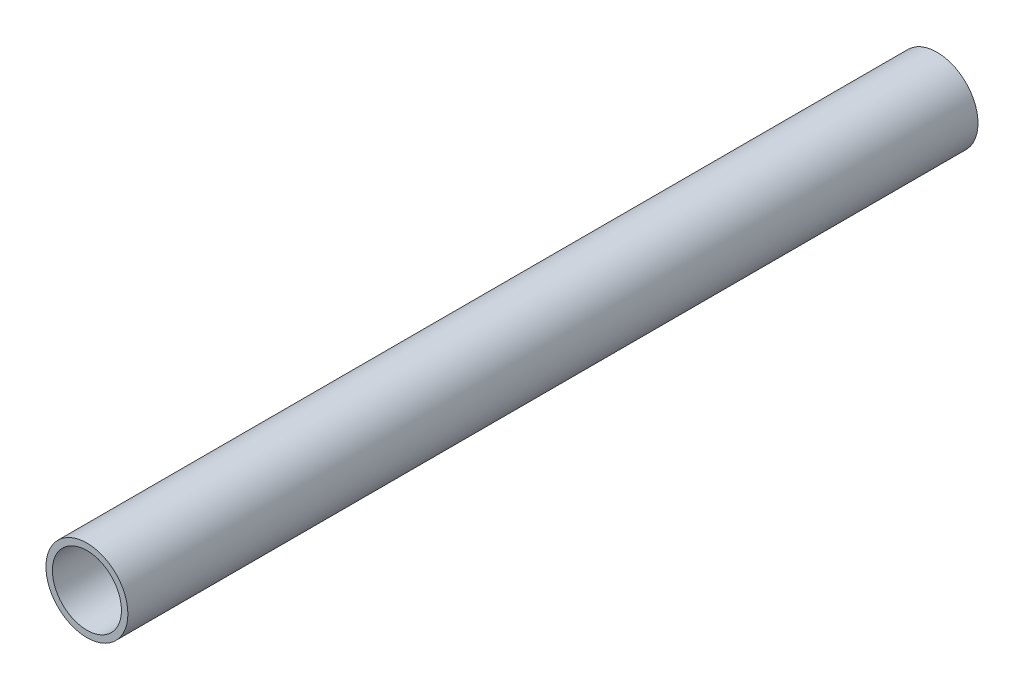
ISO-10303-21;
HEADER;
FILE_DESCRIPTION(('STEP AP214'),'2;1');
FILE_NAME('part.step','',(''),(''),'','','');
FILE_SCHEMA(('AUTOMOTIVE_DESIGN { 1 0 10303 214 1 1 1 1 }'));
ENDSEC;
DATA;
#1=APPLICATION_CONTEXT('core data for automotive mechanical design processes');
#2=APPLICATION_PROTOCOL_DEFINITION('international standard','automotive_design',2000,#1);
#3=PRODUCT_CONTEXT('',#1,'mechanical');
#4=PRODUCT('Part','Part','',(#3));
#5=PRODUCT_RELATED_PRODUCT_CATEGORY('part','',(#4));
#6=PRODUCT_DEFINITION_FORMATION('','',#4);
#7=PRODUCT_DEFINITION_CONTEXT('part definition',#1,'design');
#8=PRODUCT_DEFINITION('design','',#6,#7);
#9=PRODUCT_DEFINITION_SHAPE('','',#8);
#10=(LENGTH_UNIT() NAMED_UNIT(*) SI_UNIT(.MILLI.,.METRE.));
#11=(NAMED_UNIT(*) PLANE_ANGLE_UNIT() SI_UNIT($,.RADIAN.));
#12=(NAMED_UNIT(*) SI_UNIT($,.STERADIAN.) SOLID_ANGLE_UNIT());
#13=UNCERTAINTY_MEASURE_WITH_UNIT(LENGTH_MEASURE(1.E-05),#10,'distance_accuracy_value','');
#14=(GEOMETRIC_REPRESENTATION_CONTEXT(3) GLOBAL_UNCERTAINTY_ASSIGNED_CONTEXT((#13)) GLOBAL_UNIT_ASSIGNED_CONTEXT((#10,
#11,#12)) REPRESENTATION_CONTEXT('',''));
#15=CARTESIAN_POINT('',(0.,0.,0.));
#16=DIRECTION('',(0.,0.,1.));
#17=DIRECTION('',(1.,0.,0.));
#18=AXIS2_PLACEMENT_3D('',#15,#16,#17);
#19=CARTESIAN_POINT('',(0.,0.,461.5));
#20=DIRECTION('',(0.,0.,1.));
#21=DIRECTION('',(1.,0.,0.));
#22=AXIS2_PLACEMENT_3D('',#19,#20,#21);
#23=PLANE('',#22);
#24=CARTESIAN_POINT('',(0.,0.,461.5));
#25=DIRECTION('',(0.,0.,1.));
#26=DIRECTION('',(1.,0.,0.));
#27=AXIS2_PLACEMENT_3D('',#24,#25,#26);
#28=CIRCLE('',#27,44.5);
#29=CARTESIAN_POINT('',(44.5,0.,461.5));
#30=VERTEX_POINT('',#29);
#31=EDGE_CURVE('E10',#30,#30,#28,.T.);
#32=ORIENTED_EDGE('',*,*,#31,.T.);
#33=EDGE_LOOP('',(#32));
#34=FACE_BOUND('',#33,.T.);
#35=CARTESIAN_POINT('',(0.,0.,461.5));
#36=DIRECTION('',(0.,0.,1.));
#37=DIRECTION('',(1.,0.,0.));
#38=AXIS2_PLACEMENT_3D('',#35,#36,#37);
#39=CIRCLE('',#38,37.5);
#40=CARTESIAN_POINT('',(37.5,0.,461.5));
#41=VERTEX_POINT('',#40);
#42=EDGE_CURVE('E42',#41,#41,#39,.T.);
#43=ORIENTED_EDGE('',*,*,#42,.F.);
#44=EDGE_LOOP('',(#43));
#45=FACE_BOUND('',#44,.T.);
#46=ADVANCED_FACE('F31',(#34,#45),#23,.T.);
#47=CARTESIAN_POINT('',(0.,0.,-461.5));
#48=DIRECTION('',(0.,0.,1.));
#49=DIRECTION('',(1.,0.,0.));
#50=AXIS2_PLACEMENT_3D('',#47,#48,#49);
#51=PLANE('',#50);
#52=CARTESIAN_POINT('',(0.,0.,-461.5));
#53=DIRECTION('',(0.,0.,1.));
#54=DIRECTION('',(1.,0.,0.));
#55=AXIS2_PLACEMENT_3D('',#52,#53,#54);
#56=CIRCLE('',#55,44.5);
#57=CARTESIAN_POINT('',(44.5,0.,-461.5));
#58=VERTEX_POINT('',#57);
#59=EDGE_CURVE('E35',#58,#58,#56,.T.);
#60=ORIENTED_EDGE('',*,*,#59,.F.);
#61=EDGE_LOOP('',(#60));
#62=FACE_BOUND('',#61,.T.);
#63=CARTESIAN_POINT('',(0.,0.,-461.5));
#64=DIRECTION('',(0.,0.,1.));
#65=DIRECTION('',(1.,0.,0.));
#66=AXIS2_PLACEMENT_3D('',#63,#64,#65);
#67=CIRCLE('',#66,37.5);
#68=CARTESIAN_POINT('',(37.5,0.,-461.5));
#69=VERTEX_POINT('',#68);
#70=EDGE_CURVE('E44',#69,#69,#67,.T.);
#71=ORIENTED_EDGE('',*,*,#70,.T.);
#72=EDGE_LOOP('',(#71));
#73=FACE_BOUND('',#72,.T.);
#74=ADVANCED_FACE('F54',(#62,#73),#51,.F.);
#75=CARTESIAN_POINT('',(0.,0.,461.5));
#76=DIRECTION('',(0.,0.,-1.));
#77=DIRECTION('',(-1.,0.,0.));
#78=AXIS2_PLACEMENT_3D('',#75,#76,#77);
#79=CYLINDRICAL_SURFACE('',#78,44.5);
#80=ORIENTED_EDGE('',*,*,#31,.F.);
#81=EDGE_LOOP('',(#80));
#82=FACE_BOUND('',#81,.T.);
#83=ORIENTED_EDGE('',*,*,#59,.T.);
#84=EDGE_LOOP('',(#83));
#85=FACE_BOUND('',#84,.T.);
#86=ADVANCED_FACE('F33',(#82,#85),#79,.T.);
#87=CARTESIAN_POINT('',(0.,0.,461.5));
#88=DIRECTION('',(0.,0.,-1.));
#89=DIRECTION('',(-1.,0.,0.));
#90=AXIS2_PLACEMENT_3D('',#87,#88,#89);
#91=CYLINDRICAL_SURFACE('',#90,37.5);
#92=ORIENTED_EDGE('',*,*,#42,.T.);
#93=EDGE_LOOP('',(#92));
#94=FACE_BOUND('',#93,.T.);
#95=ORIENTED_EDGE('',*,*,#70,.F.);
#96=EDGE_LOOP('',(#95));
#97=FACE_BOUND('',#96,.T.);
#98=ADVANCED_FACE('F50',(#94,#97),#91,.F.);
#99=CLOSED_SHELL('',(#46,#74,#86,#98));
#100=MANIFOLD_SOLID_BREP('B2',#99);
#101=ADVANCED_BREP_SHAPE_REPRESENTATION('',(#18,#100),#14);
#102=SHAPE_DEFINITION_REPRESENTATION(#9,#101);
ENDSEC;
END-ISO-10303-21;
